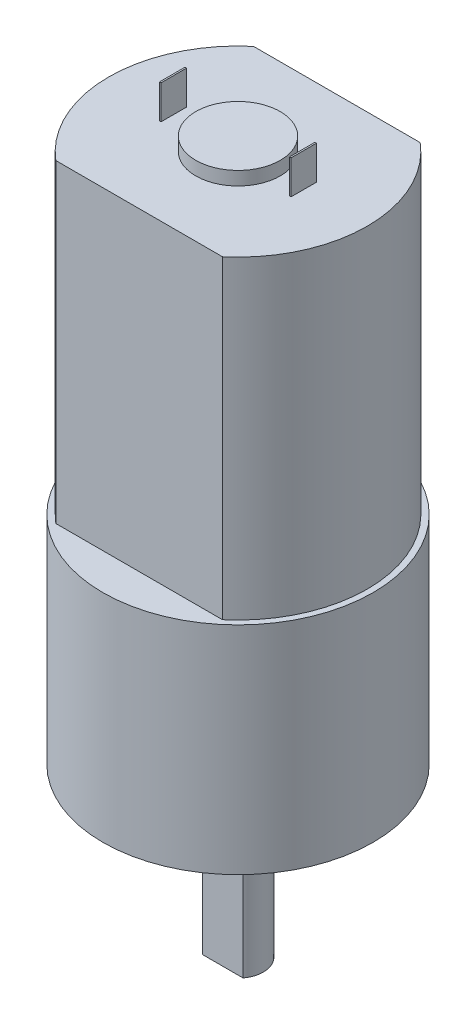
ISO-10303-21;
HEADER;
FILE_DESCRIPTION(('STEP AP214'),'2;1');
FILE_NAME('part.step','',(''),(''),'','','');
FILE_SCHEMA(('AUTOMOTIVE_DESIGN { 1 0 10303 214 1 1 1 1 }'));
ENDSEC;
DATA;
#1=APPLICATION_CONTEXT('core data for automotive mechanical design processes');
#2=APPLICATION_PROTOCOL_DEFINITION('international standard','automotive_design',2000,#1);
#3=PRODUCT_CONTEXT('',#1,'mechanical');
#4=PRODUCT('Part','Part','',(#3));
#5=PRODUCT_RELATED_PRODUCT_CATEGORY('part','',(#4));
#6=PRODUCT_DEFINITION_FORMATION('','',#4);
#7=PRODUCT_DEFINITION_CONTEXT('part definition',#1,'design');
#8=PRODUCT_DEFINITION('design','',#6,#7);
#9=PRODUCT_DEFINITION_SHAPE('','',#8);
#10=(LENGTH_UNIT() NAMED_UNIT(*) SI_UNIT(.MILLI.,.METRE.));
#11=(NAMED_UNIT(*) PLANE_ANGLE_UNIT() SI_UNIT($,.RADIAN.));
#12=(NAMED_UNIT(*) SI_UNIT($,.STERADIAN.) SOLID_ANGLE_UNIT());
#13=UNCERTAINTY_MEASURE_WITH_UNIT(LENGTH_MEASURE(1.E-05),#10,'distance_accuracy_value','');
#14=(GEOMETRIC_REPRESENTATION_CONTEXT(3) GLOBAL_UNCERTAINTY_ASSIGNED_CONTEXT((#13)) GLOBAL_UNIT_ASSIGNED_CONTEXT((#10,
#11,#12)) REPRESENTATION_CONTEXT('',''));
#15=CARTESIAN_POINT('',(0.,0.,0.));
#16=DIRECTION('',(0.,0.,1.));
#17=DIRECTION('',(1.,0.,0.));
#18=AXIS2_PLACEMENT_3D('',#15,#16,#17);
#19=CARTESIAN_POINT('',(0.,-2.3,0.));
#20=DIRECTION('',(0.,-1.,0.));
#21=DIRECTION('',(0.,0.,-1.));
#22=AXIS2_PLACEMENT_3D('',#19,#20,#21);
#23=PLANE('',#22);
#24=CARTESIAN_POINT('',(0.,-2.3,0.));
#25=DIRECTION('',(0.,-1.,0.));
#26=DIRECTION('',(0.,0.,-1.));
#27=AXIS2_PLACEMENT_3D('',#24,#25,#26);
#28=CIRCLE('',#27,3.);
#29=CARTESIAN_POINT('',(0.,-2.3,-3.));
#30=VERTEX_POINT('',#29);
#31=EDGE_CURVE('E154',#30,#30,#28,.T.);
#32=ORIENTED_EDGE('',*,*,#31,.T.);
#33=EDGE_LOOP('',(#32));
#34=FACE_BOUND('',#33,.T.);
#35=DIRECTION('',(-1.,0.,0.));
#36=VECTOR('',#35,1.);
#37=CARTESIAN_POINT('',(-1.2,-2.3,0.9));
#38=LINE('',#37,#36);
#39=CARTESIAN_POINT('',(1.2,-2.3,0.9));
#40=VERTEX_POINT('',#39);
#41=CARTESIAN_POINT('',(-1.2,-2.3,0.9));
#42=VERTEX_POINT('',#41);
#43=EDGE_CURVE('E151',#40,#42,#38,.T.);
#44=ORIENTED_EDGE('',*,*,#43,.F.);
#45=CARTESIAN_POINT('',(0.,-2.3,0.));
#46=DIRECTION('',(0.,-1.,0.));
#47=DIRECTION('',(0.,0.,-1.));
#48=AXIS2_PLACEMENT_3D('',#45,#46,#47);
#49=CIRCLE('',#48,1.5);
#50=EDGE_CURVE('E52',#42,#40,#49,.T.);
#51=ORIENTED_EDGE('',*,*,#50,.F.);
#52=EDGE_LOOP('',(#44,#51));
#53=FACE_BOUND('',#52,.T.);
#54=ADVANCED_FACE('F37',(#34,#53),#23,.T.);
#55=CARTESIAN_POINT('',(0.,0.,0.));
#56=DIRECTION('',(0.,1.,0.));
#57=DIRECTION('',(0.,0.,1.));
#58=AXIS2_PLACEMENT_3D('',#55,#56,#57);
#59=PLANE('',#58);
#60=CARTESIAN_POINT('',(0.,0.,0.));
#61=DIRECTION('',(0.,1.,0.));
#62=DIRECTION('',(0.,0.,1.));
#63=AXIS2_PLACEMENT_3D('',#60,#61,#62);
#64=CIRCLE('',#63,8.);
#65=CARTESIAN_POINT('',(0.,0.,8.));
#66=VERTEX_POINT('',#65);
#67=EDGE_CURVE('E252',#66,#66,#64,.T.);
#68=ORIENTED_EDGE('',*,*,#67,.F.);
#69=EDGE_LOOP('',(#68));
#70=FACE_BOUND('',#69,.T.);
#71=CARTESIAN_POINT('',(0.,0.,0.));
#72=DIRECTION('',(0.,1.,0.));
#73=DIRECTION('',(0.,0.,1.));
#74=AXIS2_PLACEMENT_3D('',#71,#72,#73);
#75=CIRCLE('',#74,3.);
#76=CARTESIAN_POINT('',(0.,0.,3.));
#77=VERTEX_POINT('',#76);
#78=EDGE_CURVE('E11',#77,#77,#75,.F.);
#79=ORIENTED_EDGE('',*,*,#78,.F.);
#80=EDGE_LOOP('',(#79));
#81=FACE_BOUND('',#80,.T.);
#82=ADVANCED_FACE('F258',(#70,#81),#59,.F.);
#83=CARTESIAN_POINT('',(0.,31.4,0.));
#84=DIRECTION('',(0.,1.,0.));
#85=DIRECTION('',(0.,0.,1.));
#86=AXIS2_PLACEMENT_3D('',#83,#84,#85);
#87=PLANE('',#86);
#88=DIRECTION('',(1.,0.,0.));
#89=VECTOR('',#88,1.);
#90=CARTESIAN_POINT('',(3.8,31.4,0.75));
#91=LINE('',#90,#89);
#92=CARTESIAN_POINT('',(3.8,31.4,0.75));
#93=VERTEX_POINT('',#92);
#94=CARTESIAN_POINT('',(3.89134454147242,31.4,0.75));
#95=VERTEX_POINT('',#94);
#96=EDGE_CURVE('E202',#93,#95,#91,.T.);
#97=ORIENTED_EDGE('',*,*,#96,.F.);
#98=DIRECTION('',(0.,0.,1.));
#99=VECTOR('',#98,1.);
#100=CARTESIAN_POINT('',(3.8,31.4,-0.75));
#101=LINE('',#100,#99);
#102=CARTESIAN_POINT('',(3.8,31.4,-0.75));
#103=VERTEX_POINT('',#102);
#104=EDGE_CURVE('E188',#103,#93,#101,.T.);
#105=ORIENTED_EDGE('',*,*,#104,.F.);
#106=DIRECTION('',(-1.,0.,0.));
#107=VECTOR('',#106,1.);
#108=CARTESIAN_POINT('',(3.8,31.4,-0.75));
#109=LINE('',#108,#107);
#110=CARTESIAN_POINT('',(3.89134454147242,31.4,-0.75));
#111=VERTEX_POINT('',#110);
#112=EDGE_CURVE('E193',#111,#103,#109,.T.);
#113=ORIENTED_EDGE('',*,*,#112,.F.);
#114=DIRECTION('',(0.,0.,-1.));
#115=VECTOR('',#114,1.);
#116=CARTESIAN_POINT('',(3.89134454147242,31.4,-0.75));
#117=LINE('',#116,#115);
#118=EDGE_CURVE('E204',#95,#111,#117,.T.);
#119=ORIENTED_EDGE('',*,*,#118,.F.);
#120=EDGE_LOOP('',(#97,#105,#113,#119));
#121=FACE_BOUND('',#120,.T.);
#122=CARTESIAN_POINT('',(0.,31.4,0.));
#123=DIRECTION('',(0.,1.,0.));
#124=DIRECTION('',(0.,0.,1.));
#125=AXIS2_PLACEMENT_3D('',#122,#123,#124);
#126=CIRCLE('',#125,7.65);
#127=CARTESIAN_POINT('',(4.9295030175465,31.4,5.85));
#128=VERTEX_POINT('',#127);
#129=CARTESIAN_POINT('',(4.9295030175465,31.4,-5.85));
#130=VERTEX_POINT('',#129);
#131=EDGE_CURVE('E224',#128,#130,#126,.T.);
#132=ORIENTED_EDGE('',*,*,#131,.T.);
#133=DIRECTION('',(-1.,0.,0.));
#134=VECTOR('',#133,1.);
#135=CARTESIAN_POINT('',(-4.9295030175465,31.4,-5.85));
#136=LINE('',#135,#134);
#137=CARTESIAN_POINT('',(-4.9295030175465,31.4,-5.85));
#138=VERTEX_POINT('',#137);
#139=EDGE_CURVE('E227',#130,#138,#136,.T.);
#140=ORIENTED_EDGE('',*,*,#139,.T.);
#141=CARTESIAN_POINT('',(0.,31.4,0.));
#142=DIRECTION('',(0.,1.,0.));
#143=DIRECTION('',(0.,0.,1.));
#144=AXIS2_PLACEMENT_3D('',#141,#142,#143);
#145=CIRCLE('',#144,7.65);
#146=CARTESIAN_POINT('',(-4.9295030175465,31.4,5.85));
#147=VERTEX_POINT('',#146);
#148=EDGE_CURVE('E230',#138,#147,#145,.T.);
#149=ORIENTED_EDGE('',*,*,#148,.T.);
#150=DIRECTION('',(1.,0.,0.));
#151=VECTOR('',#150,1.);
#152=CARTESIAN_POINT('',(-4.9295030175465,31.4,5.85));
#153=LINE('',#152,#151);
#154=EDGE_CURVE('E232',#147,#128,#153,.T.);
#155=ORIENTED_EDGE('',*,*,#154,.T.);
#156=EDGE_LOOP('',(#132,#140,#149,#155));
#157=FACE_BOUND('',#156,.T.);
#158=CARTESIAN_POINT('',(0.,31.4,0.));
#159=DIRECTION('',(0.,1.,0.));
#160=DIRECTION('',(0.,0.,1.));
#161=AXIS2_PLACEMENT_3D('',#158,#159,#160);
#162=CIRCLE('',#161,2.5);
#163=CARTESIAN_POINT('',(0.,31.4,2.5));
#164=VERTEX_POINT('',#163);
#165=EDGE_CURVE('E217',#164,#164,#162,.T.);
#166=ORIENTED_EDGE('',*,*,#165,.F.);
#167=EDGE_LOOP('',(#166));
#168=FACE_BOUND('',#167,.T.);
#169=DIRECTION('',(0.,0.,1.));
#170=VECTOR('',#169,1.);
#171=CARTESIAN_POINT('',(-3.89134454147242,31.4,-0.75));
#172=LINE('',#171,#170);
#173=CARTESIAN_POINT('',(-3.89134454147242,31.4,-0.75));
#174=VERTEX_POINT('',#173);
#175=CARTESIAN_POINT('',(-3.89134454147242,31.4,0.75));
#176=VERTEX_POINT('',#175);
#177=EDGE_CURVE('E175',#174,#176,#172,.T.);
#178=ORIENTED_EDGE('',*,*,#177,.F.);
#179=DIRECTION('',(-1.,0.,0.));
#180=VECTOR('',#179,1.);
#181=CARTESIAN_POINT('',(-3.8,31.4,-0.75));
#182=LINE('',#181,#180);
#183=CARTESIAN_POINT('',(-3.8,31.4,-0.75));
#184=VERTEX_POINT('',#183);
#185=EDGE_CURVE('E157',#184,#174,#182,.T.);
#186=ORIENTED_EDGE('',*,*,#185,.F.);
#187=DIRECTION('',(0.,0.,-1.));
#188=VECTOR('',#187,1.);
#189=CARTESIAN_POINT('',(-3.8,31.4,-0.75));
#190=LINE('',#189,#188);
#191=CARTESIAN_POINT('',(-3.8,31.4,0.75));
#192=VERTEX_POINT('',#191);
#193=EDGE_CURVE('E166',#192,#184,#190,.T.);
#194=ORIENTED_EDGE('',*,*,#193,.F.);
#195=DIRECTION('',(1.,0.,0.));
#196=VECTOR('',#195,1.);
#197=CARTESIAN_POINT('',(-3.8,31.4,0.75));
#198=LINE('',#197,#196);
#199=EDGE_CURVE('E177',#176,#192,#198,.T.);
#200=ORIENTED_EDGE('',*,*,#199,.F.);
#201=EDGE_LOOP('',(#178,#186,#194,#200));
#202=FACE_BOUND('',#201,.T.);
#203=ADVANCED_FACE('F261',(#121,#157,#168,#202),#87,.T.);
#204=CARTESIAN_POINT('',(0.,12.8,0.));
#205=DIRECTION('',(0.,1.,0.));
#206=DIRECTION('',(0.,0.,1.));
#207=AXIS2_PLACEMENT_3D('',#204,#205,#206);
#208=PLANE('',#207);
#209=CARTESIAN_POINT('',(0.,12.8,0.));
#210=DIRECTION('',(0.,1.,0.));
#211=DIRECTION('',(0.,0.,1.));
#212=AXIS2_PLACEMENT_3D('',#209,#210,#211);
#213=CIRCLE('',#212,8.);
#214=CARTESIAN_POINT('',(0.,12.8,8.));
#215=VERTEX_POINT('',#214);
#216=EDGE_CURVE('E45',#215,#215,#213,.T.);
#217=ORIENTED_EDGE('',*,*,#216,.T.);
#218=EDGE_LOOP('',(#217));
#219=FACE_BOUND('',#218,.T.);
#220=DIRECTION('',(-1.,0.,0.));
#221=VECTOR('',#220,1.);
#222=CARTESIAN_POINT('',(-4.9295030175465,12.8,-5.85));
#223=LINE('',#222,#221);
#224=CARTESIAN_POINT('',(4.9295030175465,12.8,-5.85));
#225=VERTEX_POINT('',#224);
#226=CARTESIAN_POINT('',(-4.9295030175465,12.8,-5.85));
#227=VERTEX_POINT('',#226);
#228=EDGE_CURVE('E237',#225,#227,#223,.T.);
#229=ORIENTED_EDGE('',*,*,#228,.F.);
#230=CARTESIAN_POINT('',(0.,12.8,0.));
#231=DIRECTION('',(0.,1.,0.));
#232=DIRECTION('',(0.,0.,1.));
#233=AXIS2_PLACEMENT_3D('',#230,#231,#232);
#234=CIRCLE('',#233,7.65);
#235=CARTESIAN_POINT('',(4.9295030175465,12.8,5.85));
#236=VERTEX_POINT('',#235);
#237=EDGE_CURVE('E221',#236,#225,#234,.T.);
#238=ORIENTED_EDGE('',*,*,#237,.F.);
#239=DIRECTION('',(1.,0.,0.));
#240=VECTOR('',#239,1.);
#241=CARTESIAN_POINT('',(-4.9295030175465,12.8,5.85));
#242=LINE('',#241,#240);
#243=CARTESIAN_POINT('',(-4.9295030175465,12.8,5.85));
#244=VERTEX_POINT('',#243);
#245=EDGE_CURVE('E228',#244,#236,#242,.T.);
#246=ORIENTED_EDGE('',*,*,#245,.F.);
#247=CARTESIAN_POINT('',(0.,12.8,0.));
#248=DIRECTION('',(0.,1.,0.));
#249=DIRECTION('',(0.,0.,1.));
#250=AXIS2_PLACEMENT_3D('',#247,#248,#249);
#251=CIRCLE('',#250,7.65);
#252=EDGE_CURVE('E239',#227,#244,#251,.T.);
#253=ORIENTED_EDGE('',*,*,#252,.F.);
#254=EDGE_LOOP('',(#229,#238,#246,#253));
#255=FACE_BOUND('',#254,.T.);
#256=ADVANCED_FACE('F417',(#219,#255),#208,.T.);
#257=CARTESIAN_POINT('',(0.,12.8,0.));
#258=DIRECTION('',(0.,-1.,0.));
#259=DIRECTION('',(0.,0.,-1.));
#260=AXIS2_PLACEMENT_3D('',#257,#258,#259);
#261=CYLINDRICAL_SURFACE('',#260,8.);
#262=ORIENTED_EDGE('',*,*,#216,.F.);
#263=EDGE_LOOP('',(#262));
#264=FACE_BOUND('',#263,.T.);
#265=ORIENTED_EDGE('',*,*,#67,.T.);
#266=EDGE_LOOP('',(#265));
#267=FACE_BOUND('',#266,.T.);
#268=ADVANCED_FACE('F39',(#264,#267),#261,.T.);
#269=CARTESIAN_POINT('',(0.,31.4,0.));
#270=DIRECTION('',(0.,-1.,0.));
#271=DIRECTION('',(0.,0.,-1.));
#272=AXIS2_PLACEMENT_3D('',#269,#270,#271);
#273=CYLINDRICAL_SURFACE('',#272,7.65);
#274=ORIENTED_EDGE('',*,*,#237,.T.);
#275=DIRECTION('',(0.,-1.,0.));
#276=VECTOR('',#275,1.);
#277=CARTESIAN_POINT('',(4.9295030175465,31.4,-5.85));
#278=LINE('',#277,#276);
#279=EDGE_CURVE('E250',#130,#225,#278,.T.);
#280=ORIENTED_EDGE('',*,*,#279,.F.);
#281=ORIENTED_EDGE('',*,*,#131,.F.);
#282=DIRECTION('',(0.,-1.,0.));
#283=VECTOR('',#282,1.);
#284=CARTESIAN_POINT('',(4.9295030175465,31.4,5.85));
#285=LINE('',#284,#283);
#286=EDGE_CURVE('E234',#128,#236,#285,.T.);
#287=ORIENTED_EDGE('',*,*,#286,.T.);
#288=EDGE_LOOP('',(#274,#280,#281,#287));
#289=FACE_BOUND('',#288,.T.);
#290=ADVANCED_FACE('F467',(#289),#273,.T.);
#291=CARTESIAN_POINT('',(-4.9295030175465,31.4,-5.85));
#292=DIRECTION('',(0.,0.,1.));
#293=DIRECTION('',(1.,0.,0.));
#294=AXIS2_PLACEMENT_3D('',#291,#292,#293);
#295=PLANE('',#294);
#296=ORIENTED_EDGE('',*,*,#228,.T.);
#297=DIRECTION('',(0.,-1.,0.));
#298=VECTOR('',#297,1.);
#299=CARTESIAN_POINT('',(-4.9295030175465,31.4,-5.85));
#300=LINE('',#299,#298);
#301=EDGE_CURVE('E247',#138,#227,#300,.T.);
#302=ORIENTED_EDGE('',*,*,#301,.F.);
#303=ORIENTED_EDGE('',*,*,#139,.F.);
#304=ORIENTED_EDGE('',*,*,#279,.T.);
#305=EDGE_LOOP('',(#296,#302,#303,#304));
#306=FACE_BOUND('',#305,.T.);
#307=ADVANCED_FACE('F457',(#306),#295,.F.);
#308=CARTESIAN_POINT('',(0.,31.4,0.));
#309=DIRECTION('',(0.,-1.,0.));
#310=DIRECTION('',(0.,0.,-1.));
#311=AXIS2_PLACEMENT_3D('',#308,#309,#310);
#312=CYLINDRICAL_SURFACE('',#311,7.65);
#313=ORIENTED_EDGE('',*,*,#252,.T.);
#314=DIRECTION('',(0.,-1.,0.));
#315=VECTOR('',#314,1.);
#316=CARTESIAN_POINT('',(-4.9295030175465,31.4,5.85));
#317=LINE('',#316,#315);
#318=EDGE_CURVE('E245',#147,#244,#317,.T.);
#319=ORIENTED_EDGE('',*,*,#318,.F.);
#320=ORIENTED_EDGE('',*,*,#148,.F.);
#321=ORIENTED_EDGE('',*,*,#301,.T.);
#322=EDGE_LOOP('',(#313,#319,#320,#321));
#323=FACE_BOUND('',#322,.T.);
#324=ADVANCED_FACE('F447',(#323),#312,.T.);
#325=CARTESIAN_POINT('',(-4.9295030175465,31.4,5.85));
#326=DIRECTION('',(0.,0.,-1.));
#327=DIRECTION('',(-1.,0.,0.));
#328=AXIS2_PLACEMENT_3D('',#325,#326,#327);
#329=PLANE('',#328);
#330=ORIENTED_EDGE('',*,*,#245,.T.);
#331=ORIENTED_EDGE('',*,*,#286,.F.);
#332=ORIENTED_EDGE('',*,*,#154,.F.);
#333=ORIENTED_EDGE('',*,*,#318,.T.);
#334=EDGE_LOOP('',(#330,#331,#332,#333));
#335=FACE_BOUND('',#334,.T.);
#336=ADVANCED_FACE('F437',(#335),#329,.F.);
#337=CARTESIAN_POINT('',(0.,32.2,0.));
#338=DIRECTION('',(0.,-1.,0.));
#339=DIRECTION('',(0.,0.,-1.));
#340=AXIS2_PLACEMENT_3D('',#337,#338,#339);
#341=CYLINDRICAL_SURFACE('',#340,2.5);
#342=CARTESIAN_POINT('',(0.,32.2,0.));
#343=DIRECTION('',(0.,1.,0.));
#344=DIRECTION('',(0.,0.,1.));
#345=AXIS2_PLACEMENT_3D('',#342,#343,#344);
#346=CIRCLE('',#345,2.5);
#347=CARTESIAN_POINT('',(0.,32.2,2.5));
#348=VERTEX_POINT('',#347);
#349=EDGE_CURVE('E218',#348,#348,#346,.T.);
#350=ORIENTED_EDGE('',*,*,#349,.F.);
#351=EDGE_LOOP('',(#350));
#352=FACE_BOUND('',#351,.T.);
#353=ORIENTED_EDGE('',*,*,#165,.T.);
#354=EDGE_LOOP('',(#353));
#355=FACE_BOUND('',#354,.T.);
#356=ADVANCED_FACE('F427',(#352,#355),#341,.T.);
#357=CARTESIAN_POINT('',(0.,32.2,0.));
#358=DIRECTION('',(0.,1.,0.));
#359=DIRECTION('',(0.,0.,1.));
#360=AXIS2_PLACEMENT_3D('',#357,#358,#359);
#361=PLANE('',#360);
#362=ORIENTED_EDGE('',*,*,#349,.T.);
#363=EDGE_LOOP('',(#362));
#364=FACE_BOUND('',#363,.T.);
#365=ADVANCED_FACE('F407',(#364),#361,.T.);
#366=CARTESIAN_POINT('',(3.8,33.4,-0.75));
#367=DIRECTION('',(1.,0.,0.));
#368=DIRECTION('',(0.,0.,-1.));
#369=AXIS2_PLACEMENT_3D('',#366,#367,#368);
#370=PLANE('',#369);
#371=ORIENTED_EDGE('',*,*,#104,.T.);
#372=DIRECTION('',(0.,-1.,0.));
#373=VECTOR('',#372,1.);
#374=CARTESIAN_POINT('',(3.8,33.4,0.75));
#375=LINE('',#374,#373);
#376=CARTESIAN_POINT('',(3.8,33.4,0.75));
#377=VERTEX_POINT('',#376);
#378=EDGE_CURVE('E215',#377,#93,#375,.T.);
#379=ORIENTED_EDGE('',*,*,#378,.F.);
#380=DIRECTION('',(0.,0.,1.));
#381=VECTOR('',#380,1.);
#382=CARTESIAN_POINT('',(3.8,33.4,-0.75));
#383=LINE('',#382,#381);
#384=CARTESIAN_POINT('',(3.8,33.4,-0.75));
#385=VERTEX_POINT('',#384);
#386=EDGE_CURVE('E189',#385,#377,#383,.T.);
#387=ORIENTED_EDGE('',*,*,#386,.F.);
#388=DIRECTION('',(0.,-1.,0.));
#389=VECTOR('',#388,1.);
#390=CARTESIAN_POINT('',(3.8,33.4,-0.75));
#391=LINE('',#390,#389);
#392=EDGE_CURVE('E199',#385,#103,#391,.T.);
#393=ORIENTED_EDGE('',*,*,#392,.T.);
#394=EDGE_LOOP('',(#371,#379,#387,#393));
#395=FACE_BOUND('',#394,.T.);
#396=ADVANCED_FACE('F397',(#395),#370,.F.);
#397=CARTESIAN_POINT('',(3.8,33.4,0.75));
#398=DIRECTION('',(0.,0.,-1.));
#399=DIRECTION('',(-1.,0.,0.));
#400=AXIS2_PLACEMENT_3D('',#397,#398,#399);
#401=PLANE('',#400);
#402=ORIENTED_EDGE('',*,*,#96,.T.);
#403=DIRECTION('',(0.,-1.,0.));
#404=VECTOR('',#403,1.);
#405=CARTESIAN_POINT('',(3.89134454147242,33.4,0.75));
#406=LINE('',#405,#404);
#407=CARTESIAN_POINT('',(3.89134454147242,33.4,0.75));
#408=VERTEX_POINT('',#407);
#409=EDGE_CURVE('E212',#408,#95,#406,.T.);
#410=ORIENTED_EDGE('',*,*,#409,.F.);
#411=DIRECTION('',(1.,0.,0.));
#412=VECTOR('',#411,1.);
#413=CARTESIAN_POINT('',(3.8,33.4,0.75));
#414=LINE('',#413,#412);
#415=EDGE_CURVE('E192',#377,#408,#414,.T.);
#416=ORIENTED_EDGE('',*,*,#415,.F.);
#417=ORIENTED_EDGE('',*,*,#378,.T.);
#418=EDGE_LOOP('',(#402,#410,#416,#417));
#419=FACE_BOUND('',#418,.T.);
#420=ADVANCED_FACE('F387',(#419),#401,.F.);
#421=CARTESIAN_POINT('',(3.89134454147242,33.4,-0.75));
#422=DIRECTION('',(-1.,0.,0.));
#423=DIRECTION('',(0.,0.,1.));
#424=AXIS2_PLACEMENT_3D('',#421,#422,#423);
#425=PLANE('',#424);
#426=ORIENTED_EDGE('',*,*,#118,.T.);
#427=DIRECTION('',(0.,-1.,0.));
#428=VECTOR('',#427,1.);
#429=CARTESIAN_POINT('',(3.89134454147242,33.4,-0.75));
#430=LINE('',#429,#428);
#431=CARTESIAN_POINT('',(3.89134454147242,33.4,-0.75));
#432=VERTEX_POINT('',#431);
#433=EDGE_CURVE('E210',#432,#111,#430,.T.);
#434=ORIENTED_EDGE('',*,*,#433,.F.);
#435=DIRECTION('',(0.,0.,-1.));
#436=VECTOR('',#435,1.);
#437=CARTESIAN_POINT('',(3.89134454147242,33.4,-0.75));
#438=LINE('',#437,#436);
#439=EDGE_CURVE('E195',#408,#432,#438,.T.);
#440=ORIENTED_EDGE('',*,*,#439,.F.);
#441=ORIENTED_EDGE('',*,*,#409,.T.);
#442=EDGE_LOOP('',(#426,#434,#440,#441));
#443=FACE_BOUND('',#442,.T.);
#444=ADVANCED_FACE('F377',(#443),#425,.F.);
#445=CARTESIAN_POINT('',(3.8,33.4,-0.75));
#446=DIRECTION('',(0.,0.,1.));
#447=DIRECTION('',(1.,0.,0.));
#448=AXIS2_PLACEMENT_3D('',#445,#446,#447);
#449=PLANE('',#448);
#450=ORIENTED_EDGE('',*,*,#112,.T.);
#451=ORIENTED_EDGE('',*,*,#392,.F.);
#452=DIRECTION('',(-1.,0.,0.));
#453=VECTOR('',#452,1.);
#454=CARTESIAN_POINT('',(3.8,33.4,-0.75));
#455=LINE('',#454,#453);
#456=EDGE_CURVE('E197',#432,#385,#455,.T.);
#457=ORIENTED_EDGE('',*,*,#456,.F.);
#458=ORIENTED_EDGE('',*,*,#433,.T.);
#459=EDGE_LOOP('',(#450,#451,#457,#458));
#460=FACE_BOUND('',#459,.T.);
#461=ADVANCED_FACE('F367',(#460),#449,.F.);
#462=CARTESIAN_POINT('',(0.,33.4,0.));
#463=DIRECTION('',(0.,1.,0.));
#464=DIRECTION('',(0.,0.,1.));
#465=AXIS2_PLACEMENT_3D('',#462,#463,#464);
#466=PLANE('',#465);
#467=ORIENTED_EDGE('',*,*,#386,.T.);
#468=ORIENTED_EDGE('',*,*,#415,.T.);
#469=ORIENTED_EDGE('',*,*,#439,.T.);
#470=ORIENTED_EDGE('',*,*,#456,.T.);
#471=EDGE_LOOP('',(#467,#468,#469,#470));
#472=FACE_BOUND('',#471,.T.);
#473=ADVANCED_FACE('F357',(#472),#466,.T.);
#474=CARTESIAN_POINT('',(-3.8,33.4,-0.75));
#475=DIRECTION('',(0.,0.,1.));
#476=DIRECTION('',(1.,0.,0.));
#477=AXIS2_PLACEMENT_3D('',#474,#475,#476);
#478=PLANE('',#477);
#479=ORIENTED_EDGE('',*,*,#185,.T.);
#480=DIRECTION('',(0.,-1.,0.));
#481=VECTOR('',#480,1.);
#482=CARTESIAN_POINT('',(-3.89134454147242,33.4,-0.75));
#483=LINE('',#482,#481);
#484=CARTESIAN_POINT('',(-3.89134454147242,33.4,-0.75));
#485=VERTEX_POINT('',#484);
#486=EDGE_CURVE('E186',#485,#174,#483,.T.);
#487=ORIENTED_EDGE('',*,*,#486,.F.);
#488=DIRECTION('',(-1.,0.,0.));
#489=VECTOR('',#488,1.);
#490=CARTESIAN_POINT('',(-3.8,33.4,-0.75));
#491=LINE('',#490,#489);
#492=CARTESIAN_POINT('',(-3.8,33.4,-0.75));
#493=VERTEX_POINT('',#492);
#494=EDGE_CURVE('E162',#493,#485,#491,.T.);
#495=ORIENTED_EDGE('',*,*,#494,.F.);
#496=DIRECTION('',(0.,-1.,0.));
#497=VECTOR('',#496,1.);
#498=CARTESIAN_POINT('',(-3.8,33.4,-0.75));
#499=LINE('',#498,#497);
#500=EDGE_CURVE('E172',#493,#184,#499,.T.);
#501=ORIENTED_EDGE('',*,*,#500,.T.);
#502=EDGE_LOOP('',(#479,#487,#495,#501));
#503=FACE_BOUND('',#502,.T.);
#504=ADVANCED_FACE('F347',(#503),#478,.F.);
#505=CARTESIAN_POINT('',(-3.89134454147242,33.4,-0.75));
#506=DIRECTION('',(1.,0.,0.));
#507=DIRECTION('',(0.,0.,-1.));
#508=AXIS2_PLACEMENT_3D('',#505,#506,#507);
#509=PLANE('',#508);
#510=ORIENTED_EDGE('',*,*,#177,.T.);
#511=DIRECTION('',(0.,-1.,0.));
#512=VECTOR('',#511,1.);
#513=CARTESIAN_POINT('',(-3.89134454147242,33.4,0.75));
#514=LINE('',#513,#512);
#515=CARTESIAN_POINT('',(-3.89134454147242,33.4,0.75));
#516=VERTEX_POINT('',#515);
#517=EDGE_CURVE('E183',#516,#176,#514,.T.);
#518=ORIENTED_EDGE('',*,*,#517,.F.);
#519=DIRECTION('',(0.,0.,1.));
#520=VECTOR('',#519,1.);
#521=CARTESIAN_POINT('',(-3.89134454147242,33.4,-0.75));
#522=LINE('',#521,#520);
#523=EDGE_CURVE('E165',#485,#516,#522,.T.);
#524=ORIENTED_EDGE('',*,*,#523,.F.);
#525=ORIENTED_EDGE('',*,*,#486,.T.);
#526=EDGE_LOOP('',(#510,#518,#524,#525));
#527=FACE_BOUND('',#526,.T.);
#528=ADVANCED_FACE('F337',(#527),#509,.F.);
#529=CARTESIAN_POINT('',(-3.8,33.4,0.75));
#530=DIRECTION('',(0.,0.,-1.));
#531=DIRECTION('',(-1.,0.,0.));
#532=AXIS2_PLACEMENT_3D('',#529,#530,#531);
#533=PLANE('',#532);
#534=ORIENTED_EDGE('',*,*,#199,.T.);
#535=DIRECTION('',(0.,-1.,0.));
#536=VECTOR('',#535,1.);
#537=CARTESIAN_POINT('',(-3.8,33.4,0.75));
#538=LINE('',#537,#536);
#539=CARTESIAN_POINT('',(-3.8,33.4,0.75));
#540=VERTEX_POINT('',#539);
#541=EDGE_CURVE('E60',#540,#192,#538,.T.);
#542=ORIENTED_EDGE('',*,*,#541,.F.);
#543=DIRECTION('',(1.,0.,0.));
#544=VECTOR('',#543,1.);
#545=CARTESIAN_POINT('',(-3.8,33.4,0.75));
#546=LINE('',#545,#544);
#547=EDGE_CURVE('E168',#516,#540,#546,.T.);
#548=ORIENTED_EDGE('',*,*,#547,.F.);
#549=ORIENTED_EDGE('',*,*,#517,.T.);
#550=EDGE_LOOP('',(#534,#542,#548,#549));
#551=FACE_BOUND('',#550,.T.);
#552=ADVANCED_FACE('F328',(#551),#533,.F.);
#553=CARTESIAN_POINT('',(-3.8,33.4,-0.75));
#554=DIRECTION('',(-1.,0.,0.));
#555=DIRECTION('',(0.,0.,1.));
#556=AXIS2_PLACEMENT_3D('',#553,#554,#555);
#557=PLANE('',#556);
#558=ORIENTED_EDGE('',*,*,#193,.T.);
#559=ORIENTED_EDGE('',*,*,#500,.F.);
#560=DIRECTION('',(0.,0.,-1.));
#561=VECTOR('',#560,1.);
#562=CARTESIAN_POINT('',(-3.8,33.4,-0.75));
#563=LINE('',#562,#561);
#564=EDGE_CURVE('E170',#540,#493,#563,.T.);
#565=ORIENTED_EDGE('',*,*,#564,.F.);
#566=ORIENTED_EDGE('',*,*,#541,.T.);
#567=EDGE_LOOP('',(#558,#559,#565,#566));
#568=FACE_BOUND('',#567,.T.);
#569=ADVANCED_FACE('F274',(#568),#557,.F.);
#570=CARTESIAN_POINT('',(0.,33.4,0.));
#571=DIRECTION('',(0.,1.,0.));
#572=DIRECTION('',(0.,0.,1.));
#573=AXIS2_PLACEMENT_3D('',#570,#571,#572);
#574=PLANE('',#573);
#575=ORIENTED_EDGE('',*,*,#494,.T.);
#576=ORIENTED_EDGE('',*,*,#523,.T.);
#577=ORIENTED_EDGE('',*,*,#547,.T.);
#578=ORIENTED_EDGE('',*,*,#564,.T.);
#579=EDGE_LOOP('',(#575,#576,#577,#578));
#580=FACE_BOUND('',#579,.T.);
#581=ADVANCED_FACE('F266',(#580),#574,.T.);
#582=CARTESIAN_POINT('',(0.,-2.3,0.));
#583=DIRECTION('',(0.,1.,0.));
#584=DIRECTION('',(0.,0.,1.));
#585=AXIS2_PLACEMENT_3D('',#582,#583,#584);
#586=CYLINDRICAL_SURFACE('',#585,3.);
#587=ORIENTED_EDGE('',*,*,#31,.F.);
#588=EDGE_LOOP('',(#587));
#589=FACE_BOUND('',#588,.T.);
#590=ORIENTED_EDGE('',*,*,#78,.T.);
#591=EDGE_LOOP('',(#590));
#592=FACE_BOUND('',#591,.T.);
#593=ADVANCED_FACE('F264',(#589,#592),#586,.T.);
#594=CARTESIAN_POINT('',(0.,-9.9,0.));
#595=DIRECTION('',(0.,1.,0.));
#596=DIRECTION('',(0.,0.,1.));
#597=AXIS2_PLACEMENT_3D('',#594,#595,#596);
#598=CYLINDRICAL_SURFACE('',#597,1.5);
#599=ORIENTED_EDGE('',*,*,#50,.T.);
#600=DIRECTION('',(0.,1.,0.));
#601=VECTOR('',#600,1.);
#602=CARTESIAN_POINT('',(1.2,-9.9,0.9));
#603=LINE('',#602,#601);
#604=CARTESIAN_POINT('',(1.2,-9.9,0.9));
#605=VERTEX_POINT('',#604);
#606=EDGE_CURVE('E143',#605,#40,#603,.T.);
#607=ORIENTED_EDGE('',*,*,#606,.F.);
#608=CARTESIAN_POINT('',(0.,-9.9,0.));
#609=DIRECTION('',(0.,-1.,0.));
#610=DIRECTION('',(0.,0.,-1.));
#611=AXIS2_PLACEMENT_3D('',#608,#609,#610);
#612=CIRCLE('',#611,1.5);
#613=CARTESIAN_POINT('',(-1.2,-9.9,0.9));
#614=VERTEX_POINT('',#613);
#615=EDGE_CURVE('E148',#614,#605,#612,.T.);
#616=ORIENTED_EDGE('',*,*,#615,.F.);
#617=DIRECTION('',(0.,1.,0.));
#618=VECTOR('',#617,1.);
#619=CARTESIAN_POINT('',(-1.2,-9.9,0.9));
#620=LINE('',#619,#618);
#621=EDGE_CURVE('E145',#614,#42,#620,.T.);
#622=ORIENTED_EDGE('',*,*,#621,.T.);
#623=EDGE_LOOP('',(#599,#607,#616,#622));
#624=FACE_BOUND('',#623,.T.);
#625=ADVANCED_FACE('F153',(#624),#598,.T.);
#626=CARTESIAN_POINT('',(-1.2,-9.9,0.9));
#627=DIRECTION('',(0.,0.,-1.));
#628=DIRECTION('',(-1.,0.,0.));
#629=AXIS2_PLACEMENT_3D('',#626,#627,#628);
#630=PLANE('',#629);
#631=ORIENTED_EDGE('',*,*,#43,.T.);
#632=ORIENTED_EDGE('',*,*,#621,.F.);
#633=DIRECTION('',(-1.,0.,0.));
#634=VECTOR('',#633,1.);
#635=CARTESIAN_POINT('',(-1.2,-9.9,0.9));
#636=LINE('',#635,#634);
#637=EDGE_CURVE('E140',#605,#614,#636,.T.);
#638=ORIENTED_EDGE('',*,*,#637,.F.);
#639=ORIENTED_EDGE('',*,*,#606,.T.);
#640=EDGE_LOOP('',(#631,#632,#638,#639));
#641=FACE_BOUND('',#640,.T.);
#642=ADVANCED_FACE('F142',(#641),#630,.F.);
#643=CARTESIAN_POINT('',(0.,-9.9,0.));
#644=DIRECTION('',(0.,-1.,0.));
#645=DIRECTION('',(0.,0.,-1.));
#646=AXIS2_PLACEMENT_3D('',#643,#644,#645);
#647=PLANE('',#646);
#648=ORIENTED_EDGE('',*,*,#615,.T.);
#649=ORIENTED_EDGE('',*,*,#637,.T.);
#650=EDGE_LOOP('',(#648,#649));
#651=FACE_BOUND('',#650,.T.);
#652=ADVANCED_FACE('F150',(#651),#647,.T.);
#653=CLOSED_SHELL('',(#54,#82,#203,#256,#268,#290,#307,#324,#336,#356,#365,#396,#420,#444,#461,
#473,#504,#528,#552,#569,#581,#593,#625,#642,#652));
#654=MANIFOLD_SOLID_BREP('B2',#653);
#655=ADVANCED_BREP_SHAPE_REPRESENTATION('',(#18,#654),#14);
#656=SHAPE_DEFINITION_REPRESENTATION(#9,#655);
ENDSEC;
END-ISO-10303-21;
